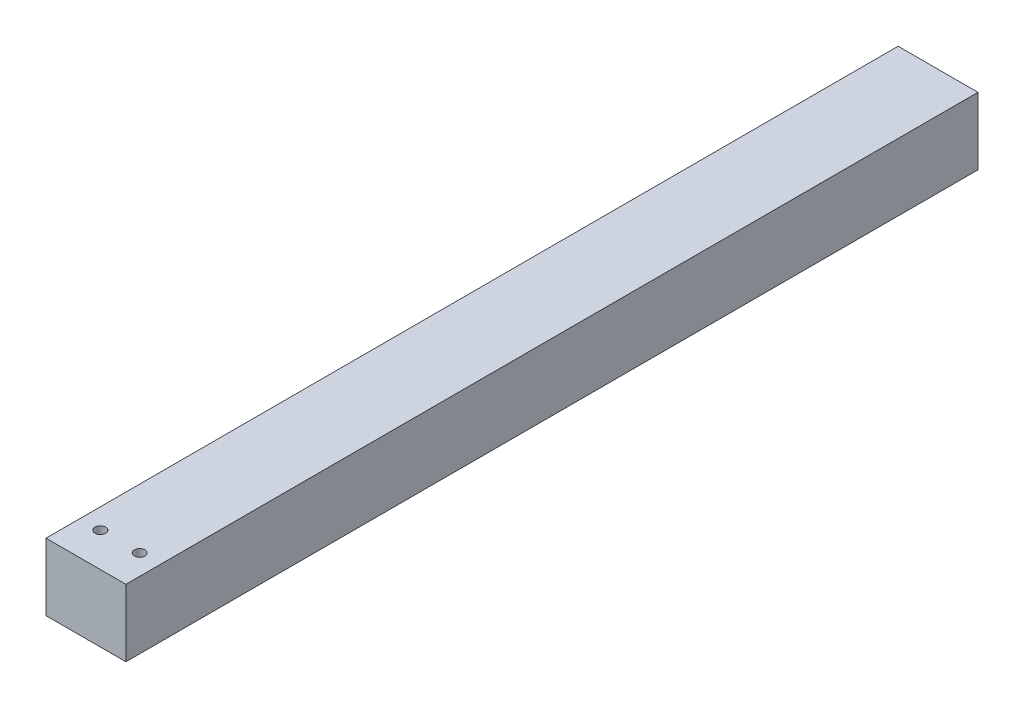
ISO-10303-21;
HEADER;
FILE_DESCRIPTION(('STEP AP214'),'2;1');
FILE_NAME('part.step','',(''),(''),'','','');
FILE_SCHEMA(('AUTOMOTIVE_DESIGN { 1 0 10303 214 1 1 1 1 }'));
ENDSEC;
DATA;
#1=APPLICATION_CONTEXT('core data for automotive mechanical design processes');
#2=APPLICATION_PROTOCOL_DEFINITION('international standard','automotive_design',2000,#1);
#3=PRODUCT_CONTEXT('',#1,'mechanical');
#4=PRODUCT('Part','Part','',(#3));
#5=PRODUCT_RELATED_PRODUCT_CATEGORY('part','',(#4));
#6=PRODUCT_DEFINITION_FORMATION('','',#4);
#7=PRODUCT_DEFINITION_CONTEXT('part definition',#1,'design');
#8=PRODUCT_DEFINITION('design','',#6,#7);
#9=PRODUCT_DEFINITION_SHAPE('','',#8);
#10=(LENGTH_UNIT() NAMED_UNIT(*) SI_UNIT(.MILLI.,.METRE.));
#11=(NAMED_UNIT(*) PLANE_ANGLE_UNIT() SI_UNIT($,.RADIAN.));
#12=(NAMED_UNIT(*) SI_UNIT($,.STERADIAN.) SOLID_ANGLE_UNIT());
#13=UNCERTAINTY_MEASURE_WITH_UNIT(LENGTH_MEASURE(1.E-05),#10,'distance_accuracy_value','');
#14=(GEOMETRIC_REPRESENTATION_CONTEXT(3) GLOBAL_UNCERTAINTY_ASSIGNED_CONTEXT((#13)) GLOBAL_UNIT_ASSIGNED_CONTEXT((#10,
#11,#12)) REPRESENTATION_CONTEXT('',''));
#15=CARTESIAN_POINT('',(0.,0.,0.));
#16=DIRECTION('',(0.,0.,1.));
#17=DIRECTION('',(1.,0.,0.));
#18=AXIS2_PLACEMENT_3D('',#15,#16,#17);
#19=CARTESIAN_POINT('',(0.,0.,800.));
#20=DIRECTION('',(1.,0.,0.));
#21=DIRECTION('',(0.,0.,-1.));
#22=AXIS2_PLACEMENT_3D('',#19,#20,#21);
#23=PLANE('',#22);
#24=DIRECTION('',(0.,-1.,0.));
#25=VECTOR('',#24,1.);
#26=CARTESIAN_POINT('',(0.,0.,0.));
#27=LINE('',#26,#25);
#28=CARTESIAN_POINT('',(0.,63.,0.));
#29=VERTEX_POINT('',#28);
#30=CARTESIAN_POINT('',(0.,0.,0.));
#31=VERTEX_POINT('',#30);
#32=EDGE_CURVE('E96',#29,#31,#27,.T.);
#33=ORIENTED_EDGE('',*,*,#32,.T.);
#34=DIRECTION('',(0.,0.,-1.));
#35=VECTOR('',#34,1.);
#36=CARTESIAN_POINT('',(0.,0.,800.));
#37=LINE('',#36,#35);
#38=CARTESIAN_POINT('',(0.,0.,800.));
#39=VERTEX_POINT('',#38);
#40=EDGE_CURVE('E11',#39,#31,#37,.T.);
#41=ORIENTED_EDGE('',*,*,#40,.F.);
#42=DIRECTION('',(0.,-1.,0.));
#43=VECTOR('',#42,1.);
#44=CARTESIAN_POINT('',(0.,0.,800.));
#45=LINE('',#44,#43);
#46=CARTESIAN_POINT('',(0.,63.,800.));
#47=VERTEX_POINT('',#46);
#48=EDGE_CURVE('E84',#47,#39,#45,.T.);
#49=ORIENTED_EDGE('',*,*,#48,.F.);
#50=DIRECTION('',(0.,0.,-1.));
#51=VECTOR('',#50,1.);
#52=CARTESIAN_POINT('',(0.,63.,800.));
#53=LINE('',#52,#51);
#54=EDGE_CURVE('E92',#47,#29,#53,.T.);
#55=ORIENTED_EDGE('',*,*,#54,.T.);
#56=EDGE_LOOP('',(#33,#41,#49,#55));
#57=FACE_BOUND('',#56,.T.);
#58=ADVANCED_FACE('F33',(#57),#23,.F.);
#59=CARTESIAN_POINT('',(0.,0.,800.));
#60=DIRECTION('',(0.,1.,0.));
#61=DIRECTION('',(0.,0.,1.));
#62=AXIS2_PLACEMENT_3D('',#59,#60,#61);
#63=PLANE('',#62);
#64=CARTESIAN_POINT('',(56.,0.,768.));
#65=DIRECTION('',(0.,-1.,0.));
#66=DIRECTION('',(0.,0.,1.));
#67=AXIS2_PLACEMENT_3D('',#64,#65,#66);
#68=CIRCLE('',#67,5.00000000000006);
#69=CARTESIAN_POINT('',(56.,0.,773.));
#70=VERTEX_POINT('',#69);
#71=EDGE_CURVE('E116',#70,#70,#68,.T.);
#72=ORIENTED_EDGE('',*,*,#71,.F.);
#73=EDGE_LOOP('',(#72));
#74=FACE_BOUND('',#73,.T.);
#75=CARTESIAN_POINT('',(19.,0.,768.));
#76=DIRECTION('',(0.,-1.,0.));
#77=DIRECTION('',(0.,0.,-1.));
#78=AXIS2_PLACEMENT_3D('',#75,#76,#77);
#79=CIRCLE('',#78,5.00000000000006);
#80=CARTESIAN_POINT('',(19.,0.,763.));
#81=VERTEX_POINT('',#80);
#82=EDGE_CURVE('E110',#81,#81,#79,.T.);
#83=ORIENTED_EDGE('',*,*,#82,.F.);
#84=EDGE_LOOP('',(#83));
#85=FACE_BOUND('',#84,.T.);
#86=DIRECTION('',(1.,0.,0.));
#87=VECTOR('',#86,1.);
#88=CARTESIAN_POINT('',(0.,0.,0.));
#89=LINE('',#88,#87);
#90=CARTESIAN_POINT('',(75.,0.,0.));
#91=VERTEX_POINT('',#90);
#92=EDGE_CURVE('E88',#31,#91,#89,.T.);
#93=ORIENTED_EDGE('',*,*,#92,.T.);
#94=DIRECTION('',(0.,0.,-1.));
#95=VECTOR('',#94,1.);
#96=CARTESIAN_POINT('',(75.,0.,800.));
#97=LINE('',#96,#95);
#98=CARTESIAN_POINT('',(75.,0.,800.));
#99=VERTEX_POINT('',#98);
#100=EDGE_CURVE('E41',#99,#91,#97,.T.);
#101=ORIENTED_EDGE('',*,*,#100,.F.);
#102=DIRECTION('',(1.,0.,0.));
#103=VECTOR('',#102,1.);
#104=CARTESIAN_POINT('',(0.,0.,800.));
#105=LINE('',#104,#103);
#106=EDGE_CURVE('E79',#39,#99,#105,.T.);
#107=ORIENTED_EDGE('',*,*,#106,.F.);
#108=ORIENTED_EDGE('',*,*,#40,.T.);
#109=EDGE_LOOP('',(#93,#101,#107,#108));
#110=FACE_BOUND('',#109,.T.);
#111=ADVANCED_FACE('F87',(#74,#85,#110),#63,.F.);
#112=CARTESIAN_POINT('',(75.,0.,800.));
#113=DIRECTION('',(-1.,0.,0.));
#114=DIRECTION('',(0.,0.,1.));
#115=AXIS2_PLACEMENT_3D('',#112,#113,#114);
#116=PLANE('',#115);
#117=DIRECTION('',(0.,1.,0.));
#118=VECTOR('',#117,1.);
#119=CARTESIAN_POINT('',(75.,0.,0.));
#120=LINE('',#119,#118);
#121=CARTESIAN_POINT('',(75.,63.,0.));
#122=VERTEX_POINT('',#121);
#123=EDGE_CURVE('E66',#91,#122,#120,.T.);
#124=ORIENTED_EDGE('',*,*,#123,.T.);
#125=DIRECTION('',(0.,0.,-1.));
#126=VECTOR('',#125,1.);
#127=CARTESIAN_POINT('',(75.,63.,800.));
#128=LINE('',#127,#126);
#129=CARTESIAN_POINT('',(75.,63.,800.));
#130=VERTEX_POINT('',#129);
#131=EDGE_CURVE('E89',#130,#122,#128,.T.);
#132=ORIENTED_EDGE('',*,*,#131,.F.);
#133=DIRECTION('',(0.,1.,0.));
#134=VECTOR('',#133,1.);
#135=CARTESIAN_POINT('',(75.,0.,800.));
#136=LINE('',#135,#134);
#137=EDGE_CURVE('E82',#99,#130,#136,.T.);
#138=ORIENTED_EDGE('',*,*,#137,.F.);
#139=ORIENTED_EDGE('',*,*,#100,.T.);
#140=EDGE_LOOP('',(#124,#132,#138,#139));
#141=FACE_BOUND('',#140,.T.);
#142=ADVANCED_FACE('F90',(#141),#116,.F.);
#143=CARTESIAN_POINT('',(0.,63.,800.));
#144=DIRECTION('',(0.,-1.,0.));
#145=DIRECTION('',(0.,0.,-1.));
#146=AXIS2_PLACEMENT_3D('',#143,#144,#145);
#147=PLANE('',#146);
#148=CARTESIAN_POINT('',(56.,63.,768.));
#149=DIRECTION('',(0.,-1.,0.));
#150=DIRECTION('',(0.,0.,1.));
#151=AXIS2_PLACEMENT_3D('',#148,#149,#150);
#152=CIRCLE('',#151,5.00000000000006);
#153=CARTESIAN_POINT('',(56.,63.,773.));
#154=VERTEX_POINT('',#153);
#155=EDGE_CURVE('E113',#154,#154,#152,.T.);
#156=ORIENTED_EDGE('',*,*,#155,.T.);
#157=EDGE_LOOP('',(#156));
#158=FACE_BOUND('',#157,.T.);
#159=CARTESIAN_POINT('',(19.,63.,768.));
#160=DIRECTION('',(0.,-1.,0.));
#161=DIRECTION('',(0.,0.,-1.));
#162=AXIS2_PLACEMENT_3D('',#159,#160,#161);
#163=CIRCLE('',#162,5.00000000000006);
#164=CARTESIAN_POINT('',(19.,63.,763.));
#165=VERTEX_POINT('',#164);
#166=EDGE_CURVE('E99',#165,#165,#163,.T.);
#167=ORIENTED_EDGE('',*,*,#166,.T.);
#168=EDGE_LOOP('',(#167));
#169=FACE_BOUND('',#168,.T.);
#170=DIRECTION('',(-1.,0.,0.));
#171=VECTOR('',#170,1.);
#172=CARTESIAN_POINT('',(0.,63.,0.));
#173=LINE('',#172,#171);
#174=EDGE_CURVE('E72',#122,#29,#173,.T.);
#175=ORIENTED_EDGE('',*,*,#174,.T.);
#176=ORIENTED_EDGE('',*,*,#54,.F.);
#177=DIRECTION('',(-1.,0.,0.));
#178=VECTOR('',#177,1.);
#179=CARTESIAN_POINT('',(0.,63.,800.));
#180=LINE('',#179,#178);
#181=EDGE_CURVE('E49',#130,#47,#180,.T.);
#182=ORIENTED_EDGE('',*,*,#181,.F.);
#183=ORIENTED_EDGE('',*,*,#131,.T.);
#184=EDGE_LOOP('',(#175,#176,#182,#183));
#185=FACE_BOUND('',#184,.T.);
#186=ADVANCED_FACE('F104',(#158,#169,#185),#147,.F.);
#187=CARTESIAN_POINT('',(0.,0.,800.));
#188=DIRECTION('',(0.,0.,-1.));
#189=DIRECTION('',(-1.,0.,0.));
#190=AXIS2_PLACEMENT_3D('',#187,#188,#189);
#191=PLANE('',#190);
#192=ORIENTED_EDGE('',*,*,#48,.T.);
#193=ORIENTED_EDGE('',*,*,#106,.T.);
#194=ORIENTED_EDGE('',*,*,#137,.T.);
#195=ORIENTED_EDGE('',*,*,#181,.T.);
#196=EDGE_LOOP('',(#192,#193,#194,#195));
#197=FACE_BOUND('',#196,.T.);
#198=ADVANCED_FACE('F80',(#197),#191,.F.);
#199=CARTESIAN_POINT('',(0.,0.,0.));
#200=DIRECTION('',(0.,0.,-1.));
#201=DIRECTION('',(-1.,0.,0.));
#202=AXIS2_PLACEMENT_3D('',#199,#200,#201);
#203=PLANE('',#202);
#204=ORIENTED_EDGE('',*,*,#32,.F.);
#205=ORIENTED_EDGE('',*,*,#174,.F.);
#206=ORIENTED_EDGE('',*,*,#123,.F.);
#207=ORIENTED_EDGE('',*,*,#92,.F.);
#208=EDGE_LOOP('',(#204,#205,#206,#207));
#209=FACE_BOUND('',#208,.T.);
#210=ADVANCED_FACE('F107',(#209),#203,.T.);
#211=CARTESIAN_POINT('',(19.,63.,768.));
#212=DIRECTION('',(0.,-1.,0.));
#213=DIRECTION('',(0.,0.,-1.));
#214=AXIS2_PLACEMENT_3D('',#211,#212,#213);
#215=CYLINDRICAL_SURFACE('',#214,5.00000000000006);
#216=ORIENTED_EDGE('',*,*,#166,.F.);
#217=EDGE_LOOP('',(#216));
#218=FACE_BOUND('',#217,.T.);
#219=ORIENTED_EDGE('',*,*,#82,.T.);
#220=EDGE_LOOP('',(#219));
#221=FACE_BOUND('',#220,.T.);
#222=ADVANCED_FACE('F127',(#218,#221),#215,.F.);
#223=CARTESIAN_POINT('',(56.,63.,768.));
#224=DIRECTION('',(0.,-1.,0.));
#225=DIRECTION('',(0.,0.,-1.));
#226=AXIS2_PLACEMENT_3D('',#223,#224,#225);
#227=CYLINDRICAL_SURFACE('',#226,5.00000000000006);
#228=ORIENTED_EDGE('',*,*,#155,.F.);
#229=EDGE_LOOP('',(#228));
#230=FACE_BOUND('',#229,.T.);
#231=ORIENTED_EDGE('',*,*,#71,.T.);
#232=EDGE_LOOP('',(#231));
#233=FACE_BOUND('',#232,.T.);
#234=ADVANCED_FACE('F124',(#230,#233),#227,.F.);
#235=CLOSED_SHELL('',(#58,#111,#142,#186,#198,#210,#222,#234));
#236=MANIFOLD_SOLID_BREP('B2',#235);
#237=ADVANCED_BREP_SHAPE_REPRESENTATION('',(#18,#236),#14);
#238=SHAPE_DEFINITION_REPRESENTATION(#9,#237);
ENDSEC;
END-ISO-10303-21;
